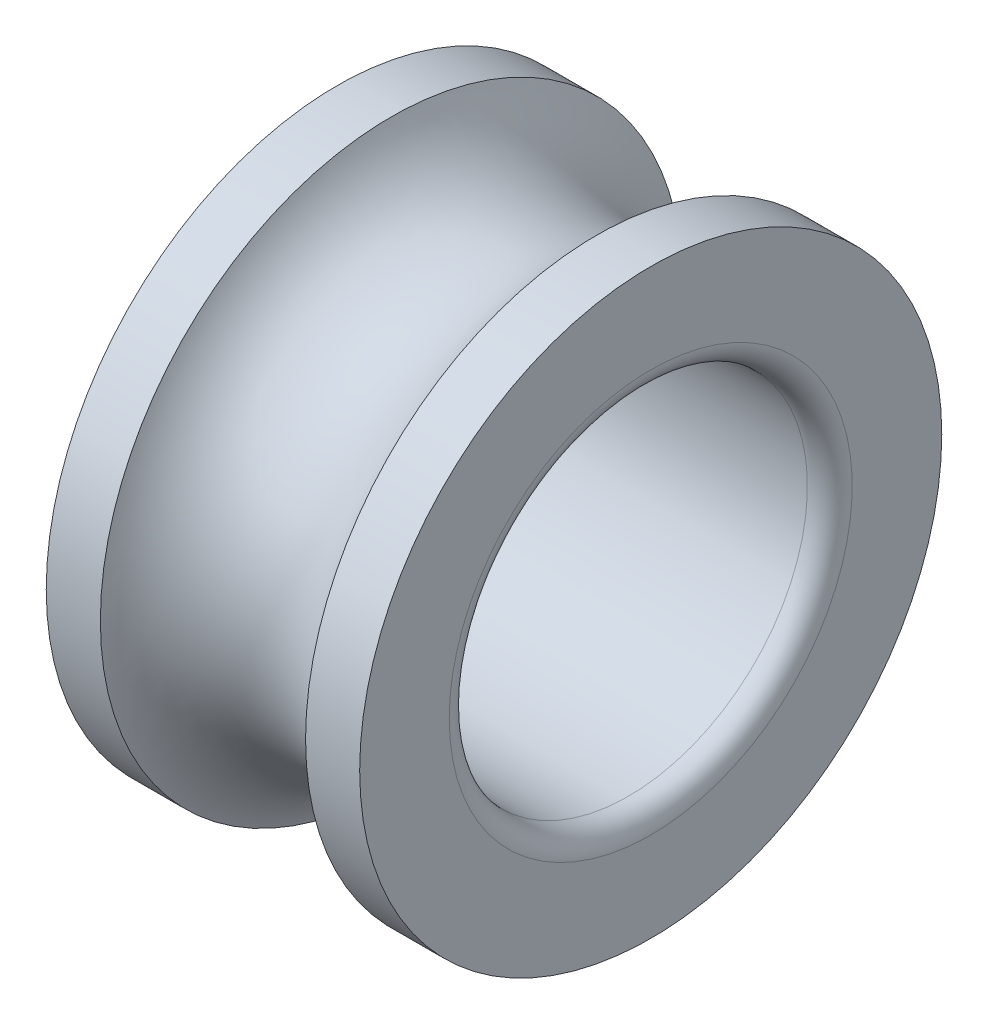
ISO-10303-21;
HEADER;
FILE_DESCRIPTION(('STEP AP214'),'2;1');
FILE_NAME('part.step','',(''),(''),'','','');
FILE_SCHEMA(('AUTOMOTIVE_DESIGN { 1 0 10303 214 1 1 1 1 }'));
ENDSEC;
DATA;
#1=APPLICATION_CONTEXT('core data for automotive mechanical design processes');
#2=APPLICATION_PROTOCOL_DEFINITION('international standard','automotive_design',2000,#1);
#3=PRODUCT_CONTEXT('',#1,'mechanical');
#4=PRODUCT('Part','Part','',(#3));
#5=PRODUCT_RELATED_PRODUCT_CATEGORY('part','',(#4));
#6=PRODUCT_DEFINITION_FORMATION('','',#4);
#7=PRODUCT_DEFINITION_CONTEXT('part definition',#1,'design');
#8=PRODUCT_DEFINITION('design','',#6,#7);
#9=PRODUCT_DEFINITION_SHAPE('','',#8);
#10=(LENGTH_UNIT() NAMED_UNIT(*) SI_UNIT(.MILLI.,.METRE.));
#11=(NAMED_UNIT(*) PLANE_ANGLE_UNIT() SI_UNIT($,.RADIAN.));
#12=(NAMED_UNIT(*) SI_UNIT($,.STERADIAN.) SOLID_ANGLE_UNIT());
#13=UNCERTAINTY_MEASURE_WITH_UNIT(LENGTH_MEASURE(1.E-05),#10,'distance_accuracy_value','');
#14=(GEOMETRIC_REPRESENTATION_CONTEXT(3) GLOBAL_UNCERTAINTY_ASSIGNED_CONTEXT((#13)) GLOBAL_UNIT_ASSIGNED_CONTEXT((#10,
#11,#12)) REPRESENTATION_CONTEXT('',''));
#15=CARTESIAN_POINT('',(0.,0.,0.));
#16=DIRECTION('',(0.,0.,1.));
#17=DIRECTION('',(1.,0.,0.));
#18=AXIS2_PLACEMENT_3D('',#15,#16,#17);
#19=CARTESIAN_POINT('',(12.6319248867625,0.,0.));
#20=DIRECTION('',(-1.,0.,0.));
#21=DIRECTION('',(0.,0.,1.));
#22=AXIS2_PLACEMENT_3D('',#19,#20,#21);
#23=TOROIDAL_SURFACE('',#22,4.5,0.5);
#24=CARTESIAN_POINT('',(12.6319248867625,0.,0.));
#25=DIRECTION('',(-1.,0.,0.));
#26=DIRECTION('',(0.,0.,1.));
#27=AXIS2_PLACEMENT_3D('',#24,#25,#26);
#28=CIRCLE('',#27,4.);
#29=CARTESIAN_POINT('',(12.6319248867625,0.,4.));
#30=VERTEX_POINT('',#29);
#31=EDGE_CURVE('E61',#30,#30,#28,.T.);
#32=ORIENTED_EDGE('',*,*,#31,.F.);
#33=EDGE_LOOP('',(#32));
#34=FACE_BOUND('',#33,.T.);
#35=CARTESIAN_POINT('',(12.1319248867625,0.,0.));
#36=DIRECTION('',(-1.,0.,0.));
#37=DIRECTION('',(0.,0.,1.));
#38=AXIS2_PLACEMENT_3D('',#35,#36,#37);
#39=CIRCLE('',#38,4.5);
#40=CARTESIAN_POINT('',(12.1319248867625,0.,4.5));
#41=VERTEX_POINT('',#40);
#42=EDGE_CURVE('E10',#41,#41,#39,.T.);
#43=ORIENTED_EDGE('',*,*,#42,.T.);
#44=EDGE_LOOP('',(#43));
#45=FACE_BOUND('',#44,.T.);
#46=ADVANCED_FACE('F33',(#34,#45),#23,.T.);
#47=CARTESIAN_POINT('',(12.1319248867625,6.5,0.));
#48=DIRECTION('',(1.,0.,0.));
#49=DIRECTION('',(0.,0.,-1.));
#50=AXIS2_PLACEMENT_3D('',#47,#48,#49);
#51=PLANE('',#50);
#52=ORIENTED_EDGE('',*,*,#42,.F.);
#53=EDGE_LOOP('',(#52));
#54=FACE_BOUND('',#53,.T.);
#55=CARTESIAN_POINT('',(12.1319248867625,0.,0.));
#56=DIRECTION('',(-1.,0.,0.));
#57=DIRECTION('',(0.,0.,1.));
#58=AXIS2_PLACEMENT_3D('',#55,#56,#57);
#59=CIRCLE('',#58,6.5);
#60=CARTESIAN_POINT('',(12.1319248867625,0.,6.5));
#61=VERTEX_POINT('',#60);
#62=EDGE_CURVE('E39',#61,#61,#59,.T.);
#63=ORIENTED_EDGE('',*,*,#62,.T.);
#64=EDGE_LOOP('',(#63));
#65=FACE_BOUND('',#64,.T.);
#66=ADVANCED_FACE('F68',(#54,#65),#51,.F.);
#67=CARTESIAN_POINT('',(0.,0.,0.));
#68=DIRECTION('',(-1.,0.,0.));
#69=DIRECTION('',(0.,0.,1.));
#70=AXIS2_PLACEMENT_3D('',#67,#68,#69);
#71=CYLINDRICAL_SURFACE('',#70,6.5);
#72=ORIENTED_EDGE('',*,*,#62,.F.);
#73=EDGE_LOOP('',(#72));
#74=FACE_BOUND('',#73,.T.);
#75=CARTESIAN_POINT('',(13.3406370392845,0.,0.));
#76=DIRECTION('',(-1.,0.,0.));
#77=DIRECTION('',(0.,0.,1.));
#78=AXIS2_PLACEMENT_3D('',#75,#76,#77);
#79=CIRCLE('',#78,6.5);
#80=CARTESIAN_POINT('',(13.3406370392845,0.,6.5));
#81=VERTEX_POINT('',#80);
#82=EDGE_CURVE('E43',#81,#81,#79,.T.);
#83=ORIENTED_EDGE('',*,*,#82,.T.);
#84=EDGE_LOOP('',(#83));
#85=FACE_BOUND('',#84,.T.);
#86=ADVANCED_FACE('F72',(#74,#85),#71,.T.);
#87=CARTESIAN_POINT('',(15.6319248867625,0.,0.));
#88=DIRECTION('',(-1.,0.,0.));
#89=DIRECTION('',(0.,0.,1.));
#90=AXIS2_PLACEMENT_3D('',#87,#88,#89);
#91=TOROIDAL_SURFACE('',#90,7.5,2.5);
#92=ORIENTED_EDGE('',*,*,#82,.F.);
#93=EDGE_LOOP('',(#92));
#94=FACE_BOUND('',#93,.T.);
#95=CARTESIAN_POINT('',(17.9232127342404,0.,0.));
#96=DIRECTION('',(-1.,0.,0.));
#97=DIRECTION('',(0.,0.,1.));
#98=AXIS2_PLACEMENT_3D('',#95,#96,#97);
#99=CIRCLE('',#98,6.5);
#100=CARTESIAN_POINT('',(17.9232127342404,0.,6.5));
#101=VERTEX_POINT('',#100);
#102=EDGE_CURVE('E47',#101,#101,#99,.T.);
#103=ORIENTED_EDGE('',*,*,#102,.T.);
#104=EDGE_LOOP('',(#103));
#105=FACE_BOUND('',#104,.T.);
#106=ADVANCED_FACE('F77',(#94,#105),#91,.F.);
#107=CARTESIAN_POINT('',(0.,0.,0.));
#108=DIRECTION('',(-1.,0.,0.));
#109=DIRECTION('',(0.,0.,1.));
#110=AXIS2_PLACEMENT_3D('',#107,#108,#109);
#111=CYLINDRICAL_SURFACE('',#110,6.5);
#112=ORIENTED_EDGE('',*,*,#102,.F.);
#113=EDGE_LOOP('',(#112));
#114=FACE_BOUND('',#113,.T.);
#115=CARTESIAN_POINT('',(19.1319248867625,0.,0.));
#116=DIRECTION('',(-1.,0.,0.));
#117=DIRECTION('',(0.,0.,1.));
#118=AXIS2_PLACEMENT_3D('',#115,#116,#117);
#119=CIRCLE('',#118,6.5);
#120=CARTESIAN_POINT('',(19.1319248867625,0.,6.5));
#121=VERTEX_POINT('',#120);
#122=EDGE_CURVE('E52',#121,#121,#119,.T.);
#123=ORIENTED_EDGE('',*,*,#122,.T.);
#124=EDGE_LOOP('',(#123));
#125=FACE_BOUND('',#124,.T.);
#126=ADVANCED_FACE('F83',(#114,#125),#111,.T.);
#127=CARTESIAN_POINT('',(19.1319248867625,6.5,0.));
#128=DIRECTION('',(-1.,0.,0.));
#129=DIRECTION('',(0.,0.,1.));
#130=AXIS2_PLACEMENT_3D('',#127,#128,#129);
#131=PLANE('',#130);
#132=ORIENTED_EDGE('',*,*,#122,.F.);
#133=EDGE_LOOP('',(#132));
#134=FACE_BOUND('',#133,.T.);
#135=CARTESIAN_POINT('',(19.1319248867625,0.,0.));
#136=DIRECTION('',(-1.,0.,0.));
#137=DIRECTION('',(0.,0.,1.));
#138=AXIS2_PLACEMENT_3D('',#135,#136,#137);
#139=CIRCLE('',#138,4.5);
#140=CARTESIAN_POINT('',(19.1319248867625,0.,4.5));
#141=VERTEX_POINT('',#140);
#142=EDGE_CURVE('E55',#141,#141,#139,.T.);
#143=ORIENTED_EDGE('',*,*,#142,.T.);
#144=EDGE_LOOP('',(#143));
#145=FACE_BOUND('',#144,.T.);
#146=ADVANCED_FACE('F87',(#134,#145),#131,.F.);
#147=CARTESIAN_POINT('',(18.6319248867625,0.,0.));
#148=DIRECTION('',(-1.,0.,0.));
#149=DIRECTION('',(0.,0.,1.));
#150=AXIS2_PLACEMENT_3D('',#147,#148,#149);
#151=TOROIDAL_SURFACE('',#150,4.5,0.5);
#152=ORIENTED_EDGE('',*,*,#142,.F.);
#153=EDGE_LOOP('',(#152));
#154=FACE_BOUND('',#153,.T.);
#155=CARTESIAN_POINT('',(18.6319248867625,0.,0.));
#156=DIRECTION('',(-1.,0.,0.));
#157=DIRECTION('',(0.,0.,1.));
#158=AXIS2_PLACEMENT_3D('',#155,#156,#157);
#159=CIRCLE('',#158,4.);
#160=CARTESIAN_POINT('',(18.6319248867625,0.,4.));
#161=VERTEX_POINT('',#160);
#162=EDGE_CURVE('E58',#161,#161,#159,.T.);
#163=ORIENTED_EDGE('',*,*,#162,.T.);
#164=EDGE_LOOP('',(#163));
#165=FACE_BOUND('',#164,.T.);
#166=ADVANCED_FACE('F91',(#154,#165),#151,.T.);
#167=CARTESIAN_POINT('',(0.,0.,0.));
#168=DIRECTION('',(-1.,0.,0.));
#169=DIRECTION('',(0.,0.,1.));
#170=AXIS2_PLACEMENT_3D('',#167,#168,#169);
#171=CYLINDRICAL_SURFACE('',#170,4.);
#172=ORIENTED_EDGE('',*,*,#162,.F.);
#173=EDGE_LOOP('',(#172));
#174=FACE_BOUND('',#173,.T.);
#175=ORIENTED_EDGE('',*,*,#31,.T.);
#176=EDGE_LOOP('',(#175));
#177=FACE_BOUND('',#176,.T.);
#178=ADVANCED_FACE('F65',(#174,#177),#171,.F.);
#179=CLOSED_SHELL('',(#46,#66,#86,#106,#126,#146,#166,#178));
#180=MANIFOLD_SOLID_BREP('B2',#179);
#181=ADVANCED_BREP_SHAPE_REPRESENTATION('',(#18,#180),#14);
#182=SHAPE_DEFINITION_REPRESENTATION(#9,#181);
ENDSEC;
END-ISO-10303-21;
